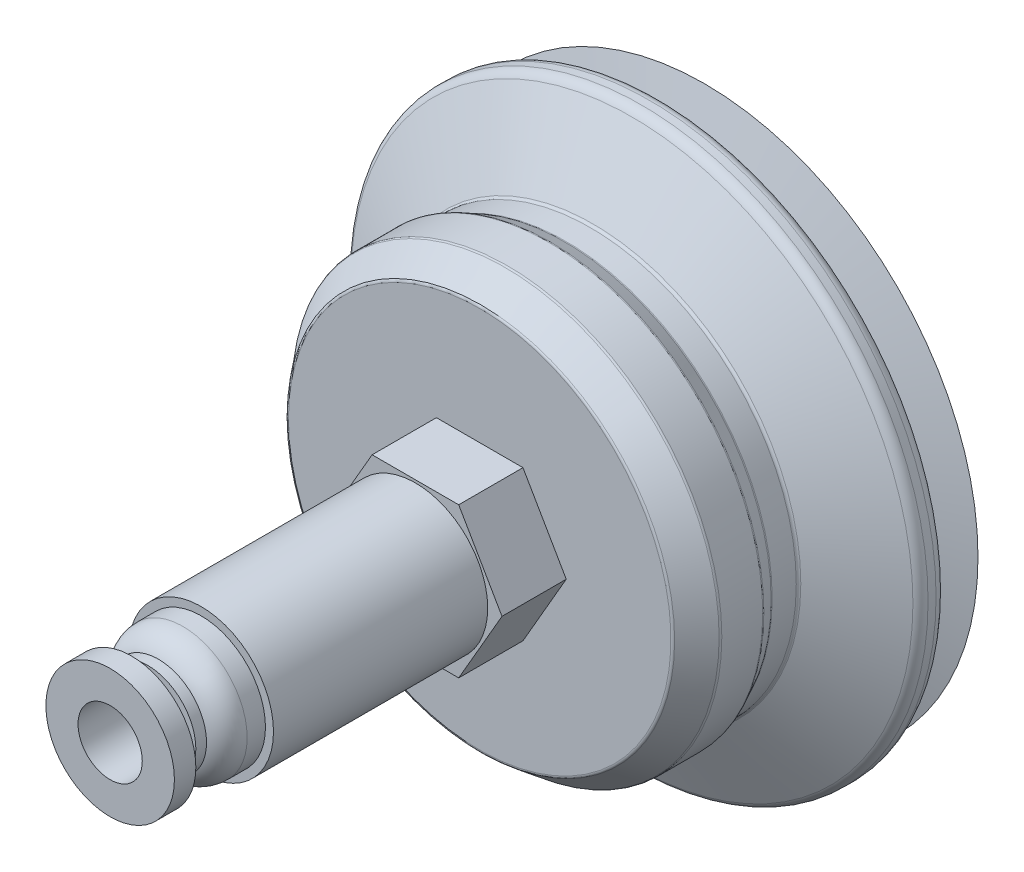
ISO-10303-21;
HEADER;
FILE_DESCRIPTION(('STEP AP214'),'2;1');
FILE_NAME('part.step','',(''),(''),'','','');
FILE_SCHEMA(('AUTOMOTIVE_DESIGN { 1 0 10303 214 1 1 1 1 }'));
ENDSEC;
DATA;
#1=APPLICATION_CONTEXT('core data for automotive mechanical design processes');
#2=APPLICATION_PROTOCOL_DEFINITION('international standard','automotive_design',2000,#1);
#3=PRODUCT_CONTEXT('',#1,'mechanical');
#4=PRODUCT('Part','Part','',(#3));
#5=PRODUCT_RELATED_PRODUCT_CATEGORY('part','',(#4));
#6=PRODUCT_DEFINITION_FORMATION('','',#4);
#7=PRODUCT_DEFINITION_CONTEXT('part definition',#1,'design');
#8=PRODUCT_DEFINITION('design','',#6,#7);
#9=PRODUCT_DEFINITION_SHAPE('','',#8);
#10=(LENGTH_UNIT() NAMED_UNIT(*) SI_UNIT(.MILLI.,.METRE.));
#11=(NAMED_UNIT(*) PLANE_ANGLE_UNIT() SI_UNIT($,.RADIAN.));
#12=(NAMED_UNIT(*) SI_UNIT($,.STERADIAN.) SOLID_ANGLE_UNIT());
#13=UNCERTAINTY_MEASURE_WITH_UNIT(LENGTH_MEASURE(1.E-05),#10,'distance_accuracy_value','');
#14=(GEOMETRIC_REPRESENTATION_CONTEXT(3) GLOBAL_UNCERTAINTY_ASSIGNED_CONTEXT((#13)) GLOBAL_UNIT_ASSIGNED_CONTEXT((#10,
#11,#12)) REPRESENTATION_CONTEXT('',''));
#15=CARTESIAN_POINT('',(0.,0.,0.));
#16=DIRECTION('',(0.,0.,1.));
#17=DIRECTION('',(1.,0.,0.));
#18=AXIS2_PLACEMENT_3D('',#15,#16,#17);
#19=CARTESIAN_POINT('',(0.,0.,-10.));
#20=DIRECTION('',(0.,0.,-1.));
#21=DIRECTION('',(-1.,0.,0.));
#22=AXIS2_PLACEMENT_3D('',#19,#20,#21);
#23=PLANE('',#22);
#24=CARTESIAN_POINT('',(0.,0.,-10.));
#25=DIRECTION('',(0.,0.,-1.));
#26=DIRECTION('',(-1.,0.,0.));
#27=AXIS2_PLACEMENT_3D('',#24,#25,#26);
#28=CIRCLE('',#27,10.);
#29=CARTESIAN_POINT('',(-10.,0.,-10.));
#30=VERTEX_POINT('',#29);
#31=EDGE_CURVE('E893',#30,#30,#28,.T.);
#32=ORIENTED_EDGE('',*,*,#31,.T.);
#33=EDGE_LOOP('',(#32));
#34=FACE_BOUND('',#33,.T.);
#35=CARTESIAN_POINT('',(0.,0.,-10.));
#36=DIRECTION('',(0.,0.,-1.));
#37=DIRECTION('',(-1.,0.,0.));
#38=AXIS2_PLACEMENT_3D('',#35,#36,#37);
#39=CIRCLE('',#38,5.75);
#40=CARTESIAN_POINT('',(-5.75,0.,-10.));
#41=VERTEX_POINT('',#40);
#42=EDGE_CURVE('E881',#41,#41,#39,.T.);
#43=ORIENTED_EDGE('',*,*,#42,.F.);
#44=EDGE_LOOP('',(#43));
#45=FACE_BOUND('',#44,.T.);
#46=ADVANCED_FACE('F44',(#34,#45),#23,.T.);
#47=CARTESIAN_POINT('',(0.,0.,34.5));
#48=DIRECTION('',(0.,0.,-1.));
#49=DIRECTION('',(-1.,0.,0.));
#50=AXIS2_PLACEMENT_3D('',#47,#48,#49);
#51=CYLINDRICAL_SURFACE('',#50,1.5);
#52=CARTESIAN_POINT('',(0.,0.,26.5));
#53=DIRECTION('',(0.,0.,1.));
#54=DIRECTION('',(1.,0.,0.));
#55=AXIS2_PLACEMENT_3D('',#52,#53,#54);
#56=CIRCLE('',#55,1.5);
#57=CARTESIAN_POINT('',(1.5,0.,26.5));
#58=VERTEX_POINT('',#57);
#59=EDGE_CURVE('E198',#58,#58,#56,.F.);
#60=ORIENTED_EDGE('',*,*,#59,.F.);
#61=EDGE_LOOP('',(#60));
#62=FACE_BOUND('',#61,.T.);
#63=CARTESIAN_POINT('',(0.,0.,-12.));
#64=DIRECTION('',(0.,0.,-1.));
#65=DIRECTION('',(-1.,0.,0.));
#66=AXIS2_PLACEMENT_3D('',#63,#64,#65);
#67=CIRCLE('',#66,1.5);
#68=CARTESIAN_POINT('',(-1.5,0.,-12.));
#69=VERTEX_POINT('',#68);
#70=EDGE_CURVE('E883',#69,#69,#67,.T.);
#71=ORIENTED_EDGE('',*,*,#70,.T.);
#72=EDGE_LOOP('',(#71));
#73=FACE_BOUND('',#72,.T.);
#74=ADVANCED_FACE('F268',(#62,#73),#51,.F.);
#75=CARTESIAN_POINT('',(4.04145188432746,-6.99999999999996,6.));
#76=DIRECTION('',(-0.866025403784441,0.499999999999995,0.));
#77=DIRECTION('',(-0.499999999999995,-0.866025403784442,0.));
#78=AXIS2_PLACEMENT_3D('',#75,#76,#77);
#79=PLANE('',#78);
#80=DIRECTION('',(0.499999999999995,0.866025403784442,0.));
#81=VECTOR('',#80,1.);
#82=CARTESIAN_POINT('',(4.04145188432746,-6.99999999999996,0.));
#83=LINE('',#82,#81);
#84=CARTESIAN_POINT('',(4.04145188432746,-6.99999999999996,0.));
#85=VERTEX_POINT('',#84);
#86=CARTESIAN_POINT('',(8.08290376865477,0.,0.));
#87=VERTEX_POINT('',#86);
#88=EDGE_CURVE('E100',#85,#87,#83,.T.);
#89=ORIENTED_EDGE('',*,*,#88,.T.);
#90=DIRECTION('',(0.,0.,-1.));
#91=VECTOR('',#90,1.);
#92=CARTESIAN_POINT('',(8.08290376865477,0.,6.));
#93=LINE('',#92,#91);
#94=CARTESIAN_POINT('',(8.08290376865477,0.,6.));
#95=VERTEX_POINT('',#94);
#96=EDGE_CURVE('E108',#95,#87,#93,.T.);
#97=ORIENTED_EDGE('',*,*,#96,.F.);
#98=DIRECTION('',(0.499999999999995,0.866025403784442,0.));
#99=VECTOR('',#98,1.);
#100=CARTESIAN_POINT('',(4.04145188432746,-6.99999999999996,6.));
#101=LINE('',#100,#99);
#102=CARTESIAN_POINT('',(4.04145188432746,-6.99999999999996,6.));
#103=VERTEX_POINT('',#102);
#104=EDGE_CURVE('E138',#103,#95,#101,.T.);
#105=ORIENTED_EDGE('',*,*,#104,.F.);
#106=DIRECTION('',(0.,0.,-1.));
#107=VECTOR('',#106,1.);
#108=CARTESIAN_POINT('',(4.04145188432746,-6.99999999999996,6.));
#109=LINE('',#108,#107);
#110=EDGE_CURVE('E117',#103,#85,#109,.T.);
#111=ORIENTED_EDGE('',*,*,#110,.T.);
#112=EDGE_LOOP('',(#89,#97,#105,#111));
#113=FACE_BOUND('',#112,.T.);
#114=ADVANCED_FACE('F120',(#113),#79,.F.);
#115=CARTESIAN_POINT('',(8.08290376865477,0.,6.));
#116=DIRECTION('',(-0.866025403784438,-0.500000000000001,0.));
#117=DIRECTION('',(0.500000000000001,-0.866025403784438,0.));
#118=AXIS2_PLACEMENT_3D('',#115,#116,#117);
#119=PLANE('',#118);
#120=DIRECTION('',(-0.500000000000001,0.866025403784438,0.));
#121=VECTOR('',#120,1.);
#122=CARTESIAN_POINT('',(8.08290376865477,0.,0.));
#123=LINE('',#122,#121);
#124=CARTESIAN_POINT('',(4.04145188432737,7.00000000000002,0.));
#125=VERTEX_POINT('',#124);
#126=EDGE_CURVE('E92',#87,#125,#123,.T.);
#127=ORIENTED_EDGE('',*,*,#126,.T.);
#128=DIRECTION('',(0.,0.,-1.));
#129=VECTOR('',#128,1.);
#130=CARTESIAN_POINT('',(4.04145188432737,7.00000000000002,6.));
#131=LINE('',#130,#129);
#132=CARTESIAN_POINT('',(4.04145188432737,7.00000000000002,6.));
#133=VERTEX_POINT('',#132);
#134=EDGE_CURVE('E112',#133,#125,#131,.T.);
#135=ORIENTED_EDGE('',*,*,#134,.F.);
#136=DIRECTION('',(-0.500000000000001,0.866025403784438,0.));
#137=VECTOR('',#136,1.);
#138=CARTESIAN_POINT('',(8.08290376865477,0.,6.));
#139=LINE('',#138,#137);
#140=EDGE_CURVE('E109',#95,#133,#139,.T.);
#141=ORIENTED_EDGE('',*,*,#140,.F.);
#142=ORIENTED_EDGE('',*,*,#96,.T.);
#143=EDGE_LOOP('',(#127,#135,#141,#142));
#144=FACE_BOUND('',#143,.T.);
#145=ADVANCED_FACE('F107',(#144),#119,.F.);
#146=CARTESIAN_POINT('',(4.04145188432737,7.00000000000002,6.));
#147=DIRECTION('',(0.,-1.,0.));
#148=DIRECTION('',(1.,0.,0.));
#149=AXIS2_PLACEMENT_3D('',#146,#147,#148);
#150=PLANE('',#149);
#151=DIRECTION('',(-1.,0.,0.));
#152=VECTOR('',#151,1.);
#153=CARTESIAN_POINT('',(4.04145188432737,7.00000000000002,0.));
#154=LINE('',#153,#152);
#155=CARTESIAN_POINT('',(-4.04145188432742,6.99999999999999,0.));
#156=VERTEX_POINT('',#155);
#157=EDGE_CURVE('E105',#125,#156,#154,.T.);
#158=ORIENTED_EDGE('',*,*,#157,.T.);
#159=DIRECTION('',(0.,0.,-1.));
#160=VECTOR('',#159,1.);
#161=CARTESIAN_POINT('',(-4.04145188432742,6.99999999999999,6.));
#162=LINE('',#161,#160);
#163=CARTESIAN_POINT('',(-4.04145188432742,6.99999999999999,6.));
#164=VERTEX_POINT('',#163);
#165=EDGE_CURVE('E144',#164,#156,#162,.T.);
#166=ORIENTED_EDGE('',*,*,#165,.F.);
#167=DIRECTION('',(-1.,0.,0.));
#168=VECTOR('',#167,1.);
#169=CARTESIAN_POINT('',(4.04145188432737,7.00000000000002,6.));
#170=LINE('',#169,#168);
#171=EDGE_CURVE('E238',#133,#164,#170,.T.);
#172=ORIENTED_EDGE('',*,*,#171,.F.);
#173=ORIENTED_EDGE('',*,*,#134,.T.);
#174=EDGE_LOOP('',(#158,#166,#172,#173));
#175=FACE_BOUND('',#174,.T.);
#176=ADVANCED_FACE('F251',(#175),#150,.F.);
#177=CARTESIAN_POINT('',(-4.04145188432742,6.99999999999999,6.));
#178=DIRECTION('',(0.866025403784441,-0.499999999999995,0.));
#179=DIRECTION('',(0.499999999999995,0.866025403784441,0.));
#180=AXIS2_PLACEMENT_3D('',#177,#178,#179);
#181=PLANE('',#180);
#182=DIRECTION('',(-0.499999999999995,-0.866025403784441,0.));
#183=VECTOR('',#182,1.);
#184=CARTESIAN_POINT('',(-4.04145188432742,6.99999999999999,0.));
#185=LINE('',#184,#183);
#186=CARTESIAN_POINT('',(-8.08290376865477,0.,0.));
#187=VERTEX_POINT('',#186);
#188=EDGE_CURVE('E127',#156,#187,#185,.T.);
#189=ORIENTED_EDGE('',*,*,#188,.T.);
#190=DIRECTION('',(0.,0.,-1.));
#191=VECTOR('',#190,1.);
#192=CARTESIAN_POINT('',(-8.08290376865477,0.,6.));
#193=LINE('',#192,#191);
#194=CARTESIAN_POINT('',(-8.08290376865477,0.,6.));
#195=VERTEX_POINT('',#194);
#196=EDGE_CURVE('E142',#195,#187,#193,.T.);
#197=ORIENTED_EDGE('',*,*,#196,.F.);
#198=DIRECTION('',(-0.499999999999995,-0.866025403784441,0.));
#199=VECTOR('',#198,1.);
#200=CARTESIAN_POINT('',(-4.04145188432742,6.99999999999999,6.));
#201=LINE('',#200,#199);
#202=EDGE_CURVE('E239',#164,#195,#201,.T.);
#203=ORIENTED_EDGE('',*,*,#202,.F.);
#204=ORIENTED_EDGE('',*,*,#165,.T.);
#205=EDGE_LOOP('',(#189,#197,#203,#204));
#206=FACE_BOUND('',#205,.T.);
#207=ADVANCED_FACE('F258',(#206),#181,.F.);
#208=CARTESIAN_POINT('',(-8.08290376865477,0.,6.));
#209=DIRECTION('',(0.866025403784434,0.500000000000007,0.));
#210=DIRECTION('',(-0.500000000000007,0.866025403784435,0.));
#211=AXIS2_PLACEMENT_3D('',#208,#209,#210);
#212=PLANE('',#211);
#213=DIRECTION('',(0.500000000000007,-0.866025403784434,0.));
#214=VECTOR('',#213,1.);
#215=CARTESIAN_POINT('',(-8.08290376865477,0.,0.));
#216=LINE('',#215,#214);
#217=CARTESIAN_POINT('',(-4.04145188432732,-7.00000000000004,0.));
#218=VERTEX_POINT('',#217);
#219=EDGE_CURVE('E133',#187,#218,#216,.T.);
#220=ORIENTED_EDGE('',*,*,#219,.T.);
#221=DIRECTION('',(0.,0.,-1.));
#222=VECTOR('',#221,1.);
#223=CARTESIAN_POINT('',(-4.04145188432732,-7.00000000000004,6.));
#224=LINE('',#223,#222);
#225=CARTESIAN_POINT('',(-4.04145188432732,-7.00000000000004,6.));
#226=VERTEX_POINT('',#225);
#227=EDGE_CURVE('E136',#226,#218,#224,.T.);
#228=ORIENTED_EDGE('',*,*,#227,.F.);
#229=DIRECTION('',(0.500000000000007,-0.866025403784434,0.));
#230=VECTOR('',#229,1.);
#231=CARTESIAN_POINT('',(-8.08290376865477,0.,6.));
#232=LINE('',#231,#230);
#233=EDGE_CURVE('E241',#195,#226,#232,.T.);
#234=ORIENTED_EDGE('',*,*,#233,.F.);
#235=ORIENTED_EDGE('',*,*,#196,.T.);
#236=EDGE_LOOP('',(#220,#228,#234,#235));
#237=FACE_BOUND('',#236,.T.);
#238=ADVANCED_FACE('F247',(#237),#212,.F.);
#239=CARTESIAN_POINT('',(-4.04145188432732,-7.00000000000004,6.));
#240=DIRECTION('',(0.,1.,0.));
#241=DIRECTION('',(-1.,0.,0.));
#242=AXIS2_PLACEMENT_3D('',#239,#240,#241);
#243=PLANE('',#242);
#244=DIRECTION('',(1.,0.,0.));
#245=VECTOR('',#244,1.);
#246=CARTESIAN_POINT('',(-4.04145188432732,-7.00000000000004,0.));
#247=LINE('',#246,#245);
#248=EDGE_CURVE('E135',#218,#85,#247,.T.);
#249=ORIENTED_EDGE('',*,*,#248,.T.);
#250=ORIENTED_EDGE('',*,*,#110,.F.);
#251=DIRECTION('',(1.,0.,0.));
#252=VECTOR('',#251,1.);
#253=CARTESIAN_POINT('',(-4.04145188432732,-7.00000000000004,6.));
#254=LINE('',#253,#252);
#255=EDGE_CURVE('E64',#226,#103,#254,.T.);
#256=ORIENTED_EDGE('',*,*,#255,.F.);
#257=ORIENTED_EDGE('',*,*,#227,.T.);
#258=EDGE_LOOP('',(#249,#250,#256,#257));
#259=FACE_BOUND('',#258,.T.);
#260=ADVANCED_FACE('F249',(#259),#243,.F.);
#261=CARTESIAN_POINT('',(0.,0.,6.));
#262=DIRECTION('',(0.,0.,1.));
#263=DIRECTION('',(1.,0.,0.));
#264=AXIS2_PLACEMENT_3D('',#261,#262,#263);
#265=PLANE('',#264);
#266=CARTESIAN_POINT('',(0.,0.,6.));
#267=DIRECTION('',(0.,0.,1.));
#268=DIRECTION('',(1.,0.,0.));
#269=AXIS2_PLACEMENT_3D('',#266,#267,#268);
#270=CIRCLE('',#269,6.75);
#271=CARTESIAN_POINT('',(6.75,0.,6.));
#272=VERTEX_POINT('',#271);
#273=EDGE_CURVE('E113',#272,#272,#270,.T.);
#274=ORIENTED_EDGE('',*,*,#273,.F.);
#275=EDGE_LOOP('',(#274));
#276=FACE_BOUND('',#275,.T.);
#277=ORIENTED_EDGE('',*,*,#104,.T.);
#278=ORIENTED_EDGE('',*,*,#140,.T.);
#279=ORIENTED_EDGE('',*,*,#171,.T.);
#280=ORIENTED_EDGE('',*,*,#202,.T.);
#281=ORIENTED_EDGE('',*,*,#233,.T.);
#282=ORIENTED_EDGE('',*,*,#255,.T.);
#283=EDGE_LOOP('',(#277,#278,#279,#280,#281,#282));
#284=FACE_BOUND('',#283,.T.);
#285=ADVANCED_FACE('F242',(#276,#284),#265,.T.);
#286=CARTESIAN_POINT('',(0.,0.,26.));
#287=DIRECTION('',(0.,0.,-1.));
#288=DIRECTION('',(-1.,0.,0.));
#289=AXIS2_PLACEMENT_3D('',#286,#287,#288);
#290=CYLINDRICAL_SURFACE('',#289,6.75);
#291=CARTESIAN_POINT('',(0.,0.,26.));
#292=DIRECTION('',(0.,0.,1.));
#293=DIRECTION('',(1.,0.,0.));
#294=AXIS2_PLACEMENT_3D('',#291,#292,#293);
#295=CIRCLE('',#294,6.75);
#296=CARTESIAN_POINT('',(6.75,0.,26.));
#297=VERTEX_POINT('',#296);
#298=EDGE_CURVE('E118',#297,#297,#295,.T.);
#299=ORIENTED_EDGE('',*,*,#298,.F.);
#300=EDGE_LOOP('',(#299));
#301=FACE_BOUND('',#300,.T.);
#302=ORIENTED_EDGE('',*,*,#273,.T.);
#303=EDGE_LOOP('',(#302));
#304=FACE_BOUND('',#303,.T.);
#305=ADVANCED_FACE('F373',(#301,#304),#290,.T.);
#306=CARTESIAN_POINT('',(0.,0.,26.));
#307=DIRECTION('',(0.,0.,1.));
#308=DIRECTION('',(1.,0.,0.));
#309=AXIS2_PLACEMENT_3D('',#306,#307,#308);
#310=PLANE('',#309);
#311=CARTESIAN_POINT('',(0.,0.,26.));
#312=DIRECTION('',(0.,0.,1.));
#313=DIRECTION('',(1.,0.,0.));
#314=AXIS2_PLACEMENT_3D('',#311,#312,#313);
#315=CIRCLE('',#314,6.);
#316=CARTESIAN_POINT('',(6.,0.,26.));
#317=VERTEX_POINT('',#316);
#318=EDGE_CURVE('E233',#317,#317,#315,.T.);
#319=ORIENTED_EDGE('',*,*,#318,.F.);
#320=EDGE_LOOP('',(#319));
#321=FACE_BOUND('',#320,.T.);
#322=ORIENTED_EDGE('',*,*,#298,.T.);
#323=EDGE_LOOP('',(#322));
#324=FACE_BOUND('',#323,.T.);
#325=ADVANCED_FACE('F367',(#321,#324),#310,.T.);
#326=CARTESIAN_POINT('',(0.,0.,30.));
#327=DIRECTION('',(0.,0.,-1.));
#328=DIRECTION('',(-1.,0.,0.));
#329=AXIS2_PLACEMENT_3D('',#326,#327,#328);
#330=CYLINDRICAL_SURFACE('',#329,6.);
#331=CARTESIAN_POINT('',(0.,0.,27.7087121525221));
#332=DIRECTION('',(0.,0.,1.));
#333=DIRECTION('',(1.,0.,0.));
#334=AXIS2_PLACEMENT_3D('',#331,#332,#333);
#335=CIRCLE('',#334,6.);
#336=CARTESIAN_POINT('',(6.,0.,27.7087121525221));
#337=VERTEX_POINT('',#336);
#338=EDGE_CURVE('E11',#337,#337,#335,.F.);
#339=ORIENTED_EDGE('',*,*,#338,.T.);
#340=EDGE_LOOP('',(#339));
#341=FACE_BOUND('',#340,.T.);
#342=ORIENTED_EDGE('',*,*,#318,.T.);
#343=EDGE_LOOP('',(#342));
#344=FACE_BOUND('',#343,.T.);
#345=ADVANCED_FACE('F362',(#341,#344),#330,.T.);
#346=CARTESIAN_POINT('',(0.,0.,31.));
#347=DIRECTION('',(0.,0.,-1.));
#348=DIRECTION('',(-1.,0.,0.));
#349=AXIS2_PLACEMENT_3D('',#346,#347,#348);
#350=CYLINDRICAL_SURFACE('',#349,4.5);
#351=CARTESIAN_POINT('',(0.,0.,31.));
#352=DIRECTION('',(0.,0.,1.));
#353=DIRECTION('',(1.,0.,0.));
#354=AXIS2_PLACEMENT_3D('',#351,#352,#353);
#355=CIRCLE('',#354,4.5);
#356=CARTESIAN_POINT('',(4.5,0.,31.));
#357=VERTEX_POINT('',#356);
#358=EDGE_CURVE('E125',#357,#357,#355,.T.);
#359=ORIENTED_EDGE('',*,*,#358,.F.);
#360=EDGE_LOOP('',(#359));
#361=FACE_BOUND('',#360,.T.);
#362=CARTESIAN_POINT('',(0.,0.,30.));
#363=DIRECTION('',(0.,0.,1.));
#364=DIRECTION('',(1.,0.,0.));
#365=AXIS2_PLACEMENT_3D('',#362,#363,#364);
#366=CIRCLE('',#365,4.5);
#367=CARTESIAN_POINT('',(4.5,0.,30.));
#368=VERTEX_POINT('',#367);
#369=EDGE_CURVE('E228',#368,#368,#366,.T.);
#370=ORIENTED_EDGE('',*,*,#369,.T.);
#371=EDGE_LOOP('',(#370));
#372=FACE_BOUND('',#371,.T.);
#373=ADVANCED_FACE('F363',(#361,#372),#350,.T.);
#374=CARTESIAN_POINT('',(0.,0.,31.));
#375=DIRECTION('',(0.,0.,1.));
#376=DIRECTION('',(1.,0.,0.));
#377=AXIS2_PLACEMENT_3D('',#374,#375,#376);
#378=PLANE('',#377);
#379=CARTESIAN_POINT('',(0.,0.,31.));
#380=DIRECTION('',(0.,0.,1.));
#381=DIRECTION('',(1.,0.,0.));
#382=AXIS2_PLACEMENT_3D('',#379,#380,#381);
#383=CIRCLE('',#382,3.5);
#384=CARTESIAN_POINT('',(3.5,0.,31.));
#385=VERTEX_POINT('',#384);
#386=EDGE_CURVE('E154',#385,#385,#383,.T.);
#387=ORIENTED_EDGE('',*,*,#386,.F.);
#388=EDGE_LOOP('',(#387));
#389=FACE_BOUND('',#388,.T.);
#390=ORIENTED_EDGE('',*,*,#358,.T.);
#391=EDGE_LOOP('',(#390));
#392=FACE_BOUND('',#391,.T.);
#393=ADVANCED_FACE('F357',(#389,#392),#378,.T.);
#394=CARTESIAN_POINT('',(0.,0.,32.5));
#395=DIRECTION('',(0.,0.,-1.));
#396=DIRECTION('',(-1.,0.,0.));
#397=AXIS2_PLACEMENT_3D('',#394,#395,#396);
#398=CYLINDRICAL_SURFACE('',#397,3.5);
#399=CARTESIAN_POINT('',(0.,0.,32.5));
#400=DIRECTION('',(0.,0.,1.));
#401=DIRECTION('',(1.,0.,0.));
#402=AXIS2_PLACEMENT_3D('',#399,#400,#401);
#403=CIRCLE('',#402,3.5);
#404=CARTESIAN_POINT('',(3.5,0.,32.5));
#405=VERTEX_POINT('',#404);
#406=EDGE_CURVE('E220',#405,#405,#403,.T.);
#407=ORIENTED_EDGE('',*,*,#406,.F.);
#408=EDGE_LOOP('',(#407));
#409=FACE_BOUND('',#408,.T.);
#410=ORIENTED_EDGE('',*,*,#386,.T.);
#411=EDGE_LOOP('',(#410));
#412=FACE_BOUND('',#411,.T.);
#413=ADVANCED_FACE('F351',(#409,#412),#398,.T.);
#414=CARTESIAN_POINT('',(0.,0.,34.5));
#415=DIRECTION('',(0.,0.,-1.));
#416=DIRECTION('',(-1.,0.,0.));
#417=AXIS2_PLACEMENT_3D('',#414,#415,#416);
#418=CYLINDRICAL_SURFACE('',#417,6.);
#419=CARTESIAN_POINT('',(0.,0.,34.5));
#420=DIRECTION('',(0.,0.,1.));
#421=DIRECTION('',(1.,0.,0.));
#422=AXIS2_PLACEMENT_3D('',#419,#420,#421);
#423=CIRCLE('',#422,6.);
#424=CARTESIAN_POINT('',(6.,0.,34.5));
#425=VERTEX_POINT('',#424);
#426=EDGE_CURVE('E218',#425,#425,#423,.T.);
#427=ORIENTED_EDGE('',*,*,#426,.F.);
#428=EDGE_LOOP('',(#427));
#429=FACE_BOUND('',#428,.T.);
#430=CARTESIAN_POINT('',(0.,0.,32.5));
#431=DIRECTION('',(0.,0.,1.));
#432=DIRECTION('',(1.,0.,0.));
#433=AXIS2_PLACEMENT_3D('',#430,#431,#432);
#434=CIRCLE('',#433,6.);
#435=CARTESIAN_POINT('',(6.,0.,32.5));
#436=VERTEX_POINT('',#435);
#437=EDGE_CURVE('E201',#436,#436,#434,.T.);
#438=ORIENTED_EDGE('',*,*,#437,.T.);
#439=EDGE_LOOP('',(#438));
#440=FACE_BOUND('',#439,.T.);
#441=ADVANCED_FACE('F348',(#429,#440),#418,.T.);
#442=CARTESIAN_POINT('',(0.,0.,34.5));
#443=DIRECTION('',(0.,0.,1.));
#444=DIRECTION('',(1.,0.,0.));
#445=AXIS2_PLACEMENT_3D('',#442,#443,#444);
#446=PLANE('',#445);
#447=CARTESIAN_POINT('',(0.,0.,34.5));
#448=DIRECTION('',(0.,0.,1.));
#449=DIRECTION('',(1.,0.,0.));
#450=AXIS2_PLACEMENT_3D('',#447,#448,#449);
#451=CIRCLE('',#450,3.);
#452=CARTESIAN_POINT('',(3.,0.,34.5));
#453=VERTEX_POINT('',#452);
#454=EDGE_CURVE('E207',#453,#453,#451,.T.);
#455=ORIENTED_EDGE('',*,*,#454,.F.);
#456=EDGE_LOOP('',(#455));
#457=FACE_BOUND('',#456,.T.);
#458=ORIENTED_EDGE('',*,*,#426,.T.);
#459=EDGE_LOOP('',(#458));
#460=FACE_BOUND('',#459,.T.);
#461=ADVANCED_FACE('F342',(#457,#460),#446,.T.);
#462=CARTESIAN_POINT('',(0.,0.,32.5));
#463=DIRECTION('',(0.,0.,1.));
#464=DIRECTION('',(1.,0.,0.));
#465=AXIS2_PLACEMENT_3D('',#462,#463,#464);
#466=PLANE('',#465);
#467=ORIENTED_EDGE('',*,*,#406,.T.);
#468=EDGE_LOOP('',(#467));
#469=FACE_BOUND('',#468,.T.);
#470=ORIENTED_EDGE('',*,*,#437,.F.);
#471=EDGE_LOOP('',(#470));
#472=FACE_BOUND('',#471,.T.);
#473=ADVANCED_FACE('F343',(#469,#472),#466,.F.);
#474=CARTESIAN_POINT('',(0.,0.,0.));
#475=DIRECTION('',(0.,0.,-1.));
#476=DIRECTION('',(-1.,0.,0.));
#477=AXIS2_PLACEMENT_3D('',#474,#475,#476);
#478=CONICAL_SURFACE('',#477,18.,0.675442420521807);
#479=CARTESIAN_POINT('',(0.,0.,-0.112427203099286));
#480=DIRECTION('',(0.,0.,1.));
#481=DIRECTION('',(1.,0.,0.));
#482=AXIS2_PLACEMENT_3D('',#479,#480,#481);
#483=CIRCLE('',#482,18.0900711741229);
#484=CARTESIAN_POINT('',(18.0900711741229,0.,-0.112427203099286));
#485=VERTEX_POINT('',#484);
#486=EDGE_CURVE('E167',#485,#485,#483,.F.);
#487=ORIENTED_EDGE('',*,*,#486,.T.);
#488=EDGE_LOOP('',(#487));
#489=FACE_BOUND('',#488,.T.);
#490=CARTESIAN_POINT('',(0.,0.,-2.41777970445379));
#491=DIRECTION('',(0.,0.,1.));
#492=DIRECTION('',(1.,0.,0.));
#493=AXIS2_PLACEMENT_3D('',#490,#491,#492);
#494=CIRCLE('',#493,19.9370067985984);
#495=CARTESIAN_POINT('',(19.9370067985984,0.,-2.41777970445379));
#496=VERTEX_POINT('',#495);
#497=EDGE_CURVE('E170',#496,#496,#494,.T.);
#498=ORIENTED_EDGE('',*,*,#497,.T.);
#499=EDGE_LOOP('',(#498));
#500=FACE_BOUND('',#499,.T.);
#501=ADVANCED_FACE('F340',(#489,#500),#478,.T.);
#502=CARTESIAN_POINT('',(0.,0.,0.));
#503=DIRECTION('',(0.,0.,-1.));
#504=DIRECTION('',(-1.,0.,0.));
#505=AXIS2_PLACEMENT_3D('',#502,#503,#504);
#506=PLANE('',#505);
#507=CARTESIAN_POINT('',(0.,0.,0.));
#508=DIRECTION('',(0.,0.,-1.));
#509=DIRECTION('',(-1.,0.,0.));
#510=AXIS2_PLACEMENT_3D('',#507,#508,#509);
#511=CIRCLE('',#510,17.8559420519214);
#512=CARTESIAN_POINT('',(-17.8559420519214,0.,0.));
#513=VERTEX_POINT('',#512);
#514=EDGE_CURVE('E173',#513,#513,#511,.F.);
#515=ORIENTED_EDGE('',*,*,#514,.T.);
#516=EDGE_LOOP('',(#515));
#517=FACE_BOUND('',#516,.T.);
#518=ORIENTED_EDGE('',*,*,#88,.F.);
#519=ORIENTED_EDGE('',*,*,#248,.F.);
#520=ORIENTED_EDGE('',*,*,#219,.F.);
#521=ORIENTED_EDGE('',*,*,#188,.F.);
#522=ORIENTED_EDGE('',*,*,#157,.F.);
#523=ORIENTED_EDGE('',*,*,#126,.F.);
#524=EDGE_LOOP('',(#518,#519,#520,#521,#522,#523));
#525=FACE_BOUND('',#524,.T.);
#526=ADVANCED_FACE('F97',(#517,#525),#506,.F.);
#527=CARTESIAN_POINT('',(0.,0.,-6.5));
#528=DIRECTION('',(0.,0.,1.));
#529=DIRECTION('',(1.,0.,0.));
#530=AXIS2_PLACEMENT_3D('',#527,#528,#529);
#531=CYLINDRICAL_SURFACE('',#530,20.0028776763969);
#532=CARTESIAN_POINT('',(0.,0.,-2.6053525013545));
#533=DIRECTION('',(0.,0.,1.));
#534=DIRECTION('',(1.,0.,0.));
#535=AXIS2_PLACEMENT_3D('',#532,#533,#534);
#536=CIRCLE('',#535,20.0028776763969);
#537=CARTESIAN_POINT('',(20.0028776763969,0.,-2.6053525013545));
#538=VERTEX_POINT('',#537);
#539=EDGE_CURVE('E177',#538,#538,#536,.F.);
#540=ORIENTED_EDGE('',*,*,#539,.T.);
#541=EDGE_LOOP('',(#540));
#542=FACE_BOUND('',#541,.T.);
#543=CARTESIAN_POINT('',(0.,0.,-6.42797637227596));
#544=DIRECTION('',(0.,0.,1.));
#545=DIRECTION('',(1.,0.,0.));
#546=AXIS2_PLACEMENT_3D('',#543,#544,#545);
#547=CIRCLE('',#546,20.0028776763969);
#548=CARTESIAN_POINT('',(20.0028776763969,0.,-6.42797637227596));
#549=VERTEX_POINT('',#548);
#550=EDGE_CURVE('E176',#549,#549,#547,.T.);
#551=ORIENTED_EDGE('',*,*,#550,.T.);
#552=EDGE_LOOP('',(#551));
#553=FACE_BOUND('',#552,.T.);
#554=ADVANCED_FACE('F326',(#542,#553),#531,.T.);
#555=CARTESIAN_POINT('',(0.,0.,-6.5));
#556=DIRECTION('',(0.,0.,1.));
#557=DIRECTION('',(-1.,0.,0.));
#558=AXIS2_PLACEMENT_3D('',#555,#556,#557);
#559=CONICAL_SURFACE('',#558,20.0028776763969,0.47123889803847);
#560=CARTESIAN_POINT('',(0.,0.,-6.56417352219783));
#561=DIRECTION('',(0.,0.,-1.));
#562=DIRECTION('',(-1.,0.,0.));
#563=AXIS2_PLACEMENT_3D('',#560,#561,#562);
#564=CIRCLE('',#563,19.9701796336534);
#565=CARTESIAN_POINT('',(-19.9701796336534,0.,-6.56417352219783));
#566=VERTEX_POINT('',#565);
#567=EDGE_CURVE('E184',#566,#566,#564,.T.);
#568=ORIENTED_EDGE('',*,*,#567,.T.);
#569=EDGE_LOOP('',(#568));
#570=FACE_BOUND('',#569,.T.);
#571=CARTESIAN_POINT('',(0.,0.,-7.93582647780216));
#572=DIRECTION('',(0.,0.,1.));
#573=DIRECTION('',(1.,0.,0.));
#574=AXIS2_PLACEMENT_3D('',#571,#572,#573);
#575=CIRCLE('',#574,19.2712875448987);
#576=CARTESIAN_POINT('',(19.2712875448987,0.,-7.93582647780216));
#577=VERTEX_POINT('',#576);
#578=EDGE_CURVE('E185',#577,#577,#575,.T.);
#579=ORIENTED_EDGE('',*,*,#578,.T.);
#580=EDGE_LOOP('',(#579));
#581=FACE_BOUND('',#580,.T.);
#582=ADVANCED_FACE('F328',(#570,#581),#559,.T.);
#583=CARTESIAN_POINT('',(0.,0.,-10.5));
#584=DIRECTION('',(0.,0.,1.));
#585=DIRECTION('',(1.,0.,0.));
#586=AXIS2_PLACEMENT_3D('',#583,#584,#585);
#587=CYLINDRICAL_SURFACE('',#586,19.2385895021552);
#588=CARTESIAN_POINT('',(0.,0.,-8.07202362772403));
#589=DIRECTION('',(0.,0.,-1.));
#590=DIRECTION('',(-1.,0.,0.));
#591=AXIS2_PLACEMENT_3D('',#588,#589,#590);
#592=CIRCLE('',#591,19.2385895021552);
#593=CARTESIAN_POINT('',(-19.2385895021552,0.,-8.07202362772403));
#594=VERTEX_POINT('',#593);
#595=EDGE_CURVE('E193',#594,#594,#592,.T.);
#596=ORIENTED_EDGE('',*,*,#595,.T.);
#597=EDGE_LOOP('',(#596));
#598=FACE_BOUND('',#597,.T.);
#599=CARTESIAN_POINT('',(0.,0.,-10.3197418142917));
#600=DIRECTION('',(0.,0.,-1.));
#601=DIRECTION('',(-1.,0.,0.));
#602=AXIS2_PLACEMENT_3D('',#599,#600,#601);
#603=CIRCLE('',#602,19.2385895021552);
#604=CARTESIAN_POINT('',(-19.2385895021552,0.,-10.3197418142917));
#605=VERTEX_POINT('',#604);
#606=EDGE_CURVE('E189',#605,#605,#603,.F.);
#607=ORIENTED_EDGE('',*,*,#606,.T.);
#608=EDGE_LOOP('',(#607));
#609=FACE_BOUND('',#608,.T.);
#610=ADVANCED_FACE('F324',(#598,#609),#587,.T.);
#611=CARTESIAN_POINT('',(0.,0.,-10.5));
#612=DIRECTION('',(0.,0.,-1.));
#613=DIRECTION('',(-1.,0.,0.));
#614=AXIS2_PLACEMENT_3D('',#611,#612,#613);
#615=CONICAL_SURFACE('',#614,19.2385895021552,1.08210413623649);
#616=CARTESIAN_POINT('',(0.,0.,-10.5846260921494));
#617=DIRECTION('',(0.,0.,-1.));
#618=DIRECTION('',(-1.,0.,0.));
#619=AXIS2_PLACEMENT_3D('',#616,#617,#618);
#620=CIRCLE('',#619,19.3977480333195);
#621=CARTESIAN_POINT('',(-19.3977480333195,0.,-10.5846260921494));
#622=VERTEX_POINT('',#621);
#623=EDGE_CURVE('E54',#622,#622,#620,.T.);
#624=ORIENTED_EDGE('',*,*,#623,.T.);
#625=EDGE_LOOP('',(#624));
#626=FACE_BOUND('',#625,.T.);
#627=CARTESIAN_POINT('',(0.,0.,-14.2179130261686));
#628=DIRECTION('',(0.,0.,1.));
#629=DIRECTION('',(1.,0.,0.));
#630=AXIS2_PLACEMENT_3D('',#627,#628,#629);
#631=CIRCLE('',#630,26.2309669263265);
#632=CARTESIAN_POINT('',(26.2309669263265,0.,-14.2179130261686));
#633=VERTEX_POINT('',#632);
#634=EDGE_CURVE('E156',#633,#633,#631,.T.);
#635=ORIENTED_EDGE('',*,*,#634,.T.);
#636=EDGE_LOOP('',(#635));
#637=FACE_BOUND('',#636,.T.);
#638=ADVANCED_FACE('F319',(#626,#637),#615,.T.);
#639=CARTESIAN_POINT('',(0.,0.,-16.5));
#640=DIRECTION('',(0.,0.,1.));
#641=DIRECTION('',(1.,0.,0.));
#642=AXIS2_PLACEMENT_3D('',#639,#640,#641);
#643=CYLINDRICAL_SURFACE('',#642,26.7614953635406);
#644=CARTESIAN_POINT('',(0.,0.,-15.8493510092962));
#645=DIRECTION('',(0.,0.,1.));
#646=DIRECTION('',(1.,0.,0.));
#647=AXIS2_PLACEMENT_3D('',#644,#645,#646);
#648=CIRCLE('',#647,26.7614953635406);
#649=CARTESIAN_POINT('',(26.7614953635406,0.,-15.8493510092962));
#650=VERTEX_POINT('',#649);
#651=EDGE_CURVE('E151',#650,#650,#648,.T.);
#652=ORIENTED_EDGE('',*,*,#651,.T.);
#653=EDGE_LOOP('',(#652));
#654=FACE_BOUND('',#653,.T.);
#655=CARTESIAN_POINT('',(0.,0.,-15.1008606190276));
#656=DIRECTION('',(0.,0.,1.));
#657=DIRECTION('',(1.,0.,0.));
#658=AXIS2_PLACEMENT_3D('',#655,#656,#657);
#659=CIRCLE('',#658,26.7614953635406);
#660=CARTESIAN_POINT('',(26.7614953635406,0.,-15.1008606190276));
#661=VERTEX_POINT('',#660);
#662=EDGE_CURVE('E153',#661,#661,#659,.F.);
#663=ORIENTED_EDGE('',*,*,#662,.T.);
#664=EDGE_LOOP('',(#663));
#665=FACE_BOUND('',#664,.T.);
#666=ADVANCED_FACE('F313',(#654,#665),#643,.T.);
#667=CARTESIAN_POINT('',(0.,0.,-16.5));
#668=DIRECTION('',(0.,0.,1.));
#669=DIRECTION('',(-1.,0.,0.));
#670=AXIS2_PLACEMENT_3D('',#667,#668,#669);
#671=CONICAL_SURFACE('',#670,26.7614953635406,1.15366263556825);
#672=CARTESIAN_POINT('',(0.,0.,-19.1574398086176));
#673=DIRECTION('',(0.,0.,1.));
#674=DIRECTION('',(1.,0.,0.));
#675=AXIS2_PLACEMENT_3D('',#672,#673,#674);
#676=CIRCLE('',#675,20.7646415842573);
#677=CARTESIAN_POINT('',(20.7646415842573,0.,-19.1574398086176));
#678=VERTEX_POINT('',#677);
#679=EDGE_CURVE('E165',#678,#678,#676,.T.);
#680=ORIENTED_EDGE('',*,*,#679,.T.);
#681=EDGE_LOOP('',(#680));
#682=FACE_BOUND('',#681,.T.);
#683=CARTESIAN_POINT('',(0.,0.,-16.7636049645305));
#684=DIRECTION('',(0.,0.,-1.));
#685=DIRECTION('',(-1.,0.,0.));
#686=AXIS2_PLACEMENT_3D('',#683,#684,#685);
#687=CIRCLE('',#686,26.1666369503205);
#688=CARTESIAN_POINT('',(-26.1666369503205,0.,-16.7636049645305));
#689=VERTEX_POINT('',#688);
#690=EDGE_CURVE('E147',#689,#689,#687,.T.);
#691=ORIENTED_EDGE('',*,*,#690,.T.);
#692=EDGE_LOOP('',(#691));
#693=FACE_BOUND('',#692,.T.);
#694=ADVANCED_FACE('F309',(#682,#693),#671,.T.);
#695=CARTESIAN_POINT('',(0.,0.,-19.5));
#696=DIRECTION('',(0.,0.,-1.));
#697=DIRECTION('',(-1.,0.,0.));
#698=AXIS2_PLACEMENT_3D('',#695,#696,#697);
#699=CONICAL_SURFACE('',#698,19.9916105746135,1.30602987926736);
#700=CARTESIAN_POINT('',(0.,0.,-19.7212620884229));
#701=DIRECTION('',(0.,0.,-1.));
#702=DIRECTION('',(-1.,0.,0.));
#703=AXIS2_PLACEMENT_3D('',#700,#701,#702);
#704=CIRCLE('',#703,20.8076789019106);
#705=CARTESIAN_POINT('',(-20.8076789019106,0.,-19.7212620884229));
#706=VERTEX_POINT('',#705);
#707=EDGE_CURVE('E163',#706,#706,#704,.T.);
#708=ORIENTED_EDGE('',*,*,#707,.T.);
#709=EDGE_LOOP('',(#708));
#710=FACE_BOUND('',#709,.T.);
#711=CARTESIAN_POINT('',(0.,0.,-21.));
#712=DIRECTION('',(0.,0.,-1.));
#713=DIRECTION('',(-1.,0.,0.));
#714=AXIS2_PLACEMENT_3D('',#711,#712,#713);
#715=CIRCLE('',#714,25.5239749288997);
#716=CARTESIAN_POINT('',(-25.5239749288997,0.,-21.));
#717=VERTEX_POINT('',#716);
#718=EDGE_CURVE('E197',#717,#717,#715,.T.);
#719=ORIENTED_EDGE('',*,*,#718,.F.);
#720=EDGE_LOOP('',(#719));
#721=FACE_BOUND('',#720,.T.);
#722=ADVANCED_FACE('F306',(#710,#721),#699,.T.);
#723=CARTESIAN_POINT('',(0.,0.,-21.));
#724=DIRECTION('',(0.,0.,-1.));
#725=DIRECTION('',(-1.,0.,0.));
#726=AXIS2_PLACEMENT_3D('',#723,#724,#725);
#727=PLANE('',#726);
#728=CARTESIAN_POINT('',(0.,0.,-21.));
#729=DIRECTION('',(0.,0.,-1.));
#730=DIRECTION('',(-1.,0.,0.));
#731=AXIS2_PLACEMENT_3D('',#728,#729,#730);
#732=CIRCLE('',#731,23.5239749288997);
#733=CARTESIAN_POINT('',(-23.5239749288997,0.,-21.));
#734=VERTEX_POINT('',#733);
#735=EDGE_CURVE('E876',#734,#734,#732,.T.);
#736=ORIENTED_EDGE('',*,*,#735,.F.);
#737=EDGE_LOOP('',(#736));
#738=FACE_BOUND('',#737,.T.);
#739=ORIENTED_EDGE('',*,*,#718,.T.);
#740=EDGE_LOOP('',(#739));
#741=FACE_BOUND('',#740,.T.);
#742=ADVANCED_FACE('F305',(#738,#741),#727,.T.);
#743=CARTESIAN_POINT('',(0.,0.,-15.8493510092962));
#744=DIRECTION('',(0.,0.,1.));
#745=DIRECTION('',(1.,0.,0.));
#746=AXIS2_PLACEMENT_3D('',#743,#744,#745);
#747=TOROIDAL_SURFACE('',#746,25.7614953635406,1.);
#748=ORIENTED_EDGE('',*,*,#651,.F.);
#749=EDGE_LOOP('',(#748));
#750=FACE_BOUND('',#749,.T.);
#751=ORIENTED_EDGE('',*,*,#690,.F.);
#752=EDGE_LOOP('',(#751));
#753=FACE_BOUND('',#752,.T.);
#754=ADVANCED_FACE('F304',(#750,#753),#747,.T.);
#755=CARTESIAN_POINT('',(0.,0.,-15.1008606190276));
#756=DIRECTION('',(0.,0.,1.));
#757=DIRECTION('',(1.,0.,0.));
#758=AXIS2_PLACEMENT_3D('',#755,#756,#757);
#759=TOROIDAL_SURFACE('',#758,25.7614953635406,1.);
#760=ORIENTED_EDGE('',*,*,#634,.F.);
#761=EDGE_LOOP('',(#760));
#762=FACE_BOUND('',#761,.T.);
#763=ORIENTED_EDGE('',*,*,#662,.F.);
#764=EDGE_LOOP('',(#763));
#765=FACE_BOUND('',#764,.T.);
#766=ADVANCED_FACE('F474',(#762,#765),#759,.T.);
#767=CARTESIAN_POINT('',(0.,0.,-19.4317159951879));
#768=DIRECTION('',(0.,0.,-1.));
#769=DIRECTION('',(-1.,0.,0.));
#770=AXIS2_PLACEMENT_3D('',#767,#768,#769);
#771=TOROIDAL_SURFACE('',#770,20.8861840602912,0.3);
#772=ORIENTED_EDGE('',*,*,#679,.F.);
#773=EDGE_LOOP('',(#772));
#774=FACE_BOUND('',#773,.T.);
#775=ORIENTED_EDGE('',*,*,#707,.F.);
#776=EDGE_LOOP('',(#775));
#777=FACE_BOUND('',#776,.T.);
#778=ADVANCED_FACE('F476',(#774,#777),#771,.F.);
#779=CARTESIAN_POINT('',(0.,0.,-0.3));
#780=DIRECTION('',(0.,0.,-1.));
#781=DIRECTION('',(-1.,0.,0.));
#782=AXIS2_PLACEMENT_3D('',#779,#780,#781);
#783=TOROIDAL_SURFACE('',#782,17.8559420519214,0.3);
#784=ORIENTED_EDGE('',*,*,#514,.F.);
#785=EDGE_LOOP('',(#784));
#786=FACE_BOUND('',#785,.T.);
#787=ORIENTED_EDGE('',*,*,#486,.F.);
#788=EDGE_LOOP('',(#787));
#789=FACE_BOUND('',#788,.T.);
#790=ADVANCED_FACE('F488',(#786,#789),#783,.T.);
#791=CARTESIAN_POINT('',(0.,0.,-2.6053525013545));
#792=DIRECTION('',(0.,0.,1.));
#793=DIRECTION('',(1.,0.,0.));
#794=AXIS2_PLACEMENT_3D('',#791,#792,#793);
#795=TOROIDAL_SURFACE('',#794,19.7028776763969,0.3);
#796=ORIENTED_EDGE('',*,*,#497,.F.);
#797=EDGE_LOOP('',(#796));
#798=FACE_BOUND('',#797,.T.);
#799=ORIENTED_EDGE('',*,*,#539,.F.);
#800=EDGE_LOOP('',(#799));
#801=FACE_BOUND('',#800,.T.);
#802=ADVANCED_FACE('F490',(#798,#801),#795,.T.);
#803=CARTESIAN_POINT('',(0.,0.,-6.42797637227596));
#804=DIRECTION('',(0.,0.,1.));
#805=DIRECTION('',(1.,0.,0.));
#806=AXIS2_PLACEMENT_3D('',#803,#804,#805);
#807=TOROIDAL_SURFACE('',#806,19.7028776763969,0.3);
#808=ORIENTED_EDGE('',*,*,#550,.F.);
#809=EDGE_LOOP('',(#808));
#810=FACE_BOUND('',#809,.T.);
#811=ORIENTED_EDGE('',*,*,#567,.F.);
#812=EDGE_LOOP('',(#811));
#813=FACE_BOUND('',#812,.T.);
#814=ADVANCED_FACE('F500',(#810,#813),#807,.T.);
#815=CARTESIAN_POINT('',(0.,0.,-8.07202362772403));
#816=DIRECTION('',(0.,0.,-1.));
#817=DIRECTION('',(-1.,0.,0.));
#818=AXIS2_PLACEMENT_3D('',#815,#816,#817);
#819=TOROIDAL_SURFACE('',#818,19.5385895021552,0.3);
#820=ORIENTED_EDGE('',*,*,#578,.F.);
#821=EDGE_LOOP('',(#820));
#822=FACE_BOUND('',#821,.T.);
#823=ORIENTED_EDGE('',*,*,#595,.F.);
#824=EDGE_LOOP('',(#823));
#825=FACE_BOUND('',#824,.T.);
#826=ADVANCED_FACE('F502',(#822,#825),#819,.F.);
#827=CARTESIAN_POINT('',(0.,0.,-10.3197418142917));
#828=DIRECTION('',(0.,0.,-1.));
#829=DIRECTION('',(-1.,0.,0.));
#830=AXIS2_PLACEMENT_3D('',#827,#828,#829);
#831=TOROIDAL_SURFACE('',#830,19.5385895021552,0.3);
#832=ORIENTED_EDGE('',*,*,#606,.F.);
#833=EDGE_LOOP('',(#832));
#834=FACE_BOUND('',#833,.T.);
#835=ORIENTED_EDGE('',*,*,#623,.F.);
#836=EDGE_LOOP('',(#835));
#837=FACE_BOUND('',#836,.T.);
#838=ADVANCED_FACE('F296',(#834,#837),#831,.F.);
#839=CARTESIAN_POINT('',(0.,0.,26.5));
#840=DIRECTION('',(0.,0.,1.));
#841=DIRECTION('',(1.,0.,0.));
#842=AXIS2_PLACEMENT_3D('',#839,#840,#841);
#843=PLANE('',#842);
#844=CARTESIAN_POINT('',(0.,0.,26.5));
#845=DIRECTION('',(0.,0.,1.));
#846=DIRECTION('',(1.,0.,0.));
#847=AXIS2_PLACEMENT_3D('',#844,#845,#846);
#848=CIRCLE('',#847,3.);
#849=CARTESIAN_POINT('',(3.,0.,26.5));
#850=VERTEX_POINT('',#849);
#851=EDGE_CURVE('E200',#850,#850,#848,.T.);
#852=ORIENTED_EDGE('',*,*,#851,.T.);
#853=EDGE_LOOP('',(#852));
#854=FACE_BOUND('',#853,.T.);
#855=ORIENTED_EDGE('',*,*,#59,.T.);
#856=EDGE_LOOP('',(#855));
#857=FACE_BOUND('',#856,.T.);
#858=ADVANCED_FACE('F295',(#854,#857),#843,.T.);
#859=CARTESIAN_POINT('',(0.,0.,26.5));
#860=DIRECTION('',(0.,0.,1.));
#861=DIRECTION('',(1.,0.,0.));
#862=AXIS2_PLACEMENT_3D('',#859,#860,#861);
#863=CYLINDRICAL_SURFACE('',#862,3.);
#864=ORIENTED_EDGE('',*,*,#851,.F.);
#865=EDGE_LOOP('',(#864));
#866=FACE_BOUND('',#865,.T.);
#867=ORIENTED_EDGE('',*,*,#454,.T.);
#868=EDGE_LOOP('',(#867));
#869=FACE_BOUND('',#868,.T.);
#870=ADVANCED_FACE('F300',(#866,#869),#863,.F.);
#871=CARTESIAN_POINT('',(0.,0.,27.7087121525221));
#872=DIRECTION('',(0.,0.,1.));
#873=DIRECTION('',(1.,0.,0.));
#874=AXIS2_PLACEMENT_3D('',#871,#872,#873);
#875=TOROIDAL_SURFACE('',#874,3.5,2.5);
#876=ORIENTED_EDGE('',*,*,#338,.F.);
#877=EDGE_LOOP('',(#876));
#878=FACE_BOUND('',#877,.T.);
#879=ORIENTED_EDGE('',*,*,#369,.F.);
#880=EDGE_LOOP('',(#879));
#881=FACE_BOUND('',#880,.T.);
#882=ADVANCED_FACE('F50',(#878,#881),#875,.T.);
#883=CARTESIAN_POINT('',(0.,0.,-15.));
#884=DIRECTION('',(0.,0.,-1.));
#885=DIRECTION('',(-1.,0.,0.));
#886=AXIS2_PLACEMENT_3D('',#883,#884,#885);
#887=PLANE('',#886);
#888=CARTESIAN_POINT('',(0.,0.,-15.));
#889=DIRECTION('',(0.,0.,-1.));
#890=DIRECTION('',(-1.,0.,0.));
#891=AXIS2_PLACEMENT_3D('',#888,#889,#890);
#892=CIRCLE('',#891,10.);
#893=CARTESIAN_POINT('',(-10.,0.,-15.));
#894=VERTEX_POINT('',#893);
#895=EDGE_CURVE('E889',#894,#894,#892,.T.);
#896=ORIENTED_EDGE('',*,*,#895,.F.);
#897=EDGE_LOOP('',(#896));
#898=FACE_BOUND('',#897,.T.);
#899=CARTESIAN_POINT('',(0.,0.,-15.));
#900=DIRECTION('',(0.,0.,-1.));
#901=DIRECTION('',(-1.,0.,0.));
#902=AXIS2_PLACEMENT_3D('',#899,#900,#901);
#903=CIRCLE('',#902,16.5);
#904=CARTESIAN_POINT('',(-16.5,0.,-15.));
#905=VERTEX_POINT('',#904);
#906=EDGE_CURVE('E213',#905,#905,#903,.T.);
#907=ORIENTED_EDGE('',*,*,#906,.T.);
#908=EDGE_LOOP('',(#907));
#909=FACE_BOUND('',#908,.T.);
#910=ADVANCED_FACE('F290',(#898,#909),#887,.T.);
#911=CARTESIAN_POINT('',(0.,0.,-15.));
#912=DIRECTION('',(0.,0.,-1.));
#913=DIRECTION('',(-1.,0.,0.));
#914=AXIS2_PLACEMENT_3D('',#911,#912,#913);
#915=CYLINDRICAL_SURFACE('',#914,16.5);
#916=CARTESIAN_POINT('',(0.,0.,-18.4434821996485));
#917=DIRECTION('',(0.,0.,-1.));
#918=DIRECTION('',(-1.,0.,0.));
#919=AXIS2_PLACEMENT_3D('',#916,#917,#918);
#920=CIRCLE('',#919,16.5);
#921=CARTESIAN_POINT('',(-16.5,0.,-18.4434821996485));
#922=VERTEX_POINT('',#921);
#923=EDGE_CURVE('E47',#922,#922,#920,.T.);
#924=ORIENTED_EDGE('',*,*,#923,.T.);
#925=EDGE_LOOP('',(#924));
#926=FACE_BOUND('',#925,.T.);
#927=ORIENTED_EDGE('',*,*,#906,.F.);
#928=EDGE_LOOP('',(#927));
#929=FACE_BOUND('',#928,.T.);
#930=ADVANCED_FACE('F281',(#926,#929),#915,.F.);
#931=CARTESIAN_POINT('',(0.,0.,-10.));
#932=DIRECTION('',(0.,0.,-1.));
#933=DIRECTION('',(-1.,0.,0.));
#934=AXIS2_PLACEMENT_3D('',#931,#932,#933);
#935=CYLINDRICAL_SURFACE('',#934,10.);
#936=ORIENTED_EDGE('',*,*,#31,.F.);
#937=EDGE_LOOP('',(#936));
#938=FACE_BOUND('',#937,.T.);
#939=ORIENTED_EDGE('',*,*,#895,.T.);
#940=EDGE_LOOP('',(#939));
#941=FACE_BOUND('',#940,.T.);
#942=ADVANCED_FACE('F283',(#938,#941),#935,.F.);
#943=CARTESIAN_POINT('',(0.,0.,-12.));
#944=DIRECTION('',(0.,0.,-1.));
#945=DIRECTION('',(-1.,0.,0.));
#946=AXIS2_PLACEMENT_3D('',#943,#944,#945);
#947=PLANE('',#946);
#948=CARTESIAN_POINT('',(0.,0.,-12.));
#949=DIRECTION('',(0.,0.,-1.));
#950=DIRECTION('',(-1.,0.,0.));
#951=AXIS2_PLACEMENT_3D('',#948,#949,#950);
#952=CIRCLE('',#951,5.75);
#953=CARTESIAN_POINT('',(-5.75,0.,-12.));
#954=VERTEX_POINT('',#953);
#955=EDGE_CURVE('E890',#954,#954,#952,.T.);
#956=ORIENTED_EDGE('',*,*,#955,.T.);
#957=EDGE_LOOP('',(#956));
#958=FACE_BOUND('',#957,.T.);
#959=ORIENTED_EDGE('',*,*,#70,.F.);
#960=EDGE_LOOP('',(#959));
#961=FACE_BOUND('',#960,.T.);
#962=ADVANCED_FACE('F285',(#958,#961),#947,.T.);
#963=CARTESIAN_POINT('',(0.,0.,-12.));
#964=DIRECTION('',(0.,0.,1.));
#965=DIRECTION('',(1.,0.,0.));
#966=AXIS2_PLACEMENT_3D('',#963,#964,#965);
#967=CYLINDRICAL_SURFACE('',#966,5.75);
#968=ORIENTED_EDGE('',*,*,#955,.F.);
#969=EDGE_LOOP('',(#968));
#970=FACE_BOUND('',#969,.T.);
#971=ORIENTED_EDGE('',*,*,#42,.T.);
#972=EDGE_LOOP('',(#971));
#973=FACE_BOUND('',#972,.T.);
#974=ADVANCED_FACE('F280',(#970,#973),#967,.T.);
#975=CARTESIAN_POINT('',(0.,0.,-21.));
#976=DIRECTION('',(0.,0.,-1.));
#977=DIRECTION('',(-1.,0.,0.));
#978=AXIS2_PLACEMENT_3D('',#975,#976,#977);
#979=CONICAL_SURFACE('',#978,23.5239749288997,1.22173047639603);
#980=ORIENTED_EDGE('',*,*,#735,.T.);
#981=EDGE_LOOP('',(#980));
#982=FACE_BOUND('',#981,.T.);
#983=ORIENTED_EDGE('',*,*,#923,.F.);
#984=EDGE_LOOP('',(#983));
#985=FACE_BOUND('',#984,.T.);
#986=ADVANCED_FACE('F536',(#982,#985),#979,.F.);
#987=CLOSED_SHELL('',(#46,#74,#114,#145,#176,#207,#238,#260,#285,#305,#325,#345,#373,#393,#413,
#441,#461,#473,#501,#526,#554,#582,#610,#638,#666,#694,#722,#742,#754,#766,#778,#790,#802,#814,
#826,#838,#858,#870,#882,#910,#930,#942,#962,#974,#986));
#988=MANIFOLD_SOLID_BREP('B2',#987);
#989=ADVANCED_BREP_SHAPE_REPRESENTATION('',(#18,#988),#14);
#990=SHAPE_DEFINITION_REPRESENTATION(#9,#989);
ENDSEC;
END-ISO-10303-21;
